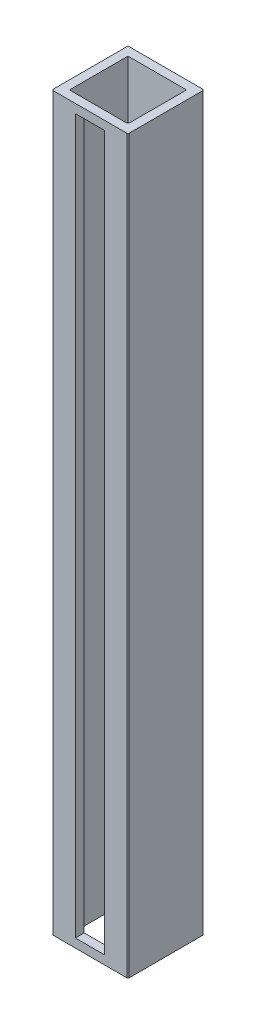
ISO-10303-21;
HEADER;
FILE_DESCRIPTION(('STEP AP214'),'2;1');
FILE_NAME('part.step','',(''),(''),'','','');
FILE_SCHEMA(('AUTOMOTIVE_DESIGN { 1 0 10303 214 1 1 1 1 }'));
ENDSEC;
DATA;
#1=APPLICATION_CONTEXT('core data for automotive mechanical design processes');
#2=APPLICATION_PROTOCOL_DEFINITION('international standard','automotive_design',2000,#1);
#3=PRODUCT_CONTEXT('',#1,'mechanical');
#4=PRODUCT('Part','Part','',(#3));
#5=PRODUCT_RELATED_PRODUCT_CATEGORY('part','',(#4));
#6=PRODUCT_DEFINITION_FORMATION('','',#4);
#7=PRODUCT_DEFINITION_CONTEXT('part definition',#1,'design');
#8=PRODUCT_DEFINITION('design','',#6,#7);
#9=PRODUCT_DEFINITION_SHAPE('','',#8);
#10=(LENGTH_UNIT() NAMED_UNIT(*) SI_UNIT(.MILLI.,.METRE.));
#11=(NAMED_UNIT(*) PLANE_ANGLE_UNIT() SI_UNIT($,.RADIAN.));
#12=(NAMED_UNIT(*) SI_UNIT($,.STERADIAN.) SOLID_ANGLE_UNIT());
#13=UNCERTAINTY_MEASURE_WITH_UNIT(LENGTH_MEASURE(1.E-05),#10,'distance_accuracy_value','');
#14=(GEOMETRIC_REPRESENTATION_CONTEXT(3) GLOBAL_UNCERTAINTY_ASSIGNED_CONTEXT((#13)) GLOBAL_UNIT_ASSIGNED_CONTEXT((#10,
#11,#12)) REPRESENTATION_CONTEXT('',''));
#15=CARTESIAN_POINT('',(0.,0.,0.));
#16=DIRECTION('',(0.,0.,1.));
#17=DIRECTION('',(1.,0.,0.));
#18=AXIS2_PLACEMENT_3D('',#15,#16,#17);
#19=CARTESIAN_POINT('',(0.,250.,0.));
#20=DIRECTION('',(0.,-1.,0.));
#21=DIRECTION('',(0.,0.,-1.));
#22=AXIS2_PLACEMENT_3D('',#19,#20,#21);
#23=PLANE('',#22);
#24=DIRECTION('',(0.,0.,-1.));
#25=VECTOR('',#24,1.);
#26=CARTESIAN_POINT('',(13.,250.,13.));
#27=LINE('',#26,#25);
#28=CARTESIAN_POINT('',(13.,250.,12.7));
#29=VERTEX_POINT('',#28);
#30=CARTESIAN_POINT('',(13.,250.,-12.7));
#31=VERTEX_POINT('',#30);
#32=EDGE_CURVE('E227',#29,#31,#27,.T.);
#33=ORIENTED_EDGE('',*,*,#32,.T.);
#34=DIRECTION('',(0.707106781186548,0.,0.707106781186548));
#35=VECTOR('',#34,1.);
#36=CARTESIAN_POINT('',(12.7,250.,-13.));
#37=LINE('',#36,#35);
#38=CARTESIAN_POINT('',(12.7,250.,-13.));
#39=VERTEX_POINT('',#38);
#40=EDGE_CURVE('E269',#31,#39,#37,.F.);
#41=ORIENTED_EDGE('',*,*,#40,.T.);
#42=DIRECTION('',(-1.,0.,0.));
#43=VECTOR('',#42,1.);
#44=CARTESIAN_POINT('',(-13.,250.,-13.));
#45=LINE('',#44,#43);
#46=CARTESIAN_POINT('',(-13.,250.,-13.));
#47=VERTEX_POINT('',#46);
#48=EDGE_CURVE('E230',#39,#47,#45,.T.);
#49=ORIENTED_EDGE('',*,*,#48,.T.);
#50=DIRECTION('',(0.,0.,1.));
#51=VECTOR('',#50,1.);
#52=CARTESIAN_POINT('',(-13.,250.,13.));
#53=LINE('',#52,#51);
#54=CARTESIAN_POINT('',(-13.,250.,12.7));
#55=VERTEX_POINT('',#54);
#56=EDGE_CURVE('E233',#47,#55,#53,.T.);
#57=ORIENTED_EDGE('',*,*,#56,.T.);
#58=DIRECTION('',(-0.707106781186548,0.,-0.707106781186548));
#59=VECTOR('',#58,1.);
#60=CARTESIAN_POINT('',(-12.7,250.,13.));
#61=LINE('',#60,#59);
#62=CARTESIAN_POINT('',(-12.7,250.,13.));
#63=VERTEX_POINT('',#62);
#64=EDGE_CURVE('E267',#55,#63,#61,.F.);
#65=ORIENTED_EDGE('',*,*,#64,.T.);
#66=DIRECTION('',(1.,0.,0.));
#67=VECTOR('',#66,1.);
#68=CARTESIAN_POINT('',(-13.,250.,13.));
#69=LINE('',#68,#67);
#70=CARTESIAN_POINT('',(12.7,250.,13.));
#71=VERTEX_POINT('',#70);
#72=EDGE_CURVE('E236',#63,#71,#69,.T.);
#73=ORIENTED_EDGE('',*,*,#72,.T.);
#74=DIRECTION('',(-0.707106781186548,0.,0.707106781186548));
#75=VECTOR('',#74,1.);
#76=CARTESIAN_POINT('',(13.,250.,12.7));
#77=LINE('',#76,#75);
#78=EDGE_CURVE('E265',#71,#29,#77,.F.);
#79=ORIENTED_EDGE('',*,*,#78,.T.);
#80=EDGE_LOOP('',(#33,#41,#49,#57,#65,#73,#79));
#81=FACE_BOUND('',#80,.T.);
#82=DIRECTION('',(0.,0.,-1.));
#83=VECTOR('',#82,1.);
#84=CARTESIAN_POINT('',(10.,250.,0.));
#85=LINE('',#84,#83);
#86=CARTESIAN_POINT('',(10.,250.,9.69999999999998));
#87=VERTEX_POINT('',#86);
#88=CARTESIAN_POINT('',(10.,250.,-10.));
#89=VERTEX_POINT('',#88);
#90=EDGE_CURVE('E214',#87,#89,#85,.T.);
#91=ORIENTED_EDGE('',*,*,#90,.F.);
#92=DIRECTION('',(0.707106781186546,0.,-0.70710678118655));
#93=VECTOR('',#92,1.);
#94=CARTESIAN_POINT('',(9.85000000000002,250.,9.84999999999996));
#95=LINE('',#94,#93);
#96=CARTESIAN_POINT('',(9.69999999999998,250.,10.));
#97=VERTEX_POINT('',#96);
#98=EDGE_CURVE('E11',#87,#97,#95,.F.);
#99=ORIENTED_EDGE('',*,*,#98,.T.);
#100=DIRECTION('',(1.,0.,0.));
#101=VECTOR('',#100,1.);
#102=CARTESIAN_POINT('',(0.,250.,10.));
#103=LINE('',#102,#101);
#104=CARTESIAN_POINT('',(-10.,250.,10.));
#105=VERTEX_POINT('',#104);
#106=EDGE_CURVE('E208',#105,#97,#103,.T.);
#107=ORIENTED_EDGE('',*,*,#106,.F.);
#108=DIRECTION('',(0.,0.,1.));
#109=VECTOR('',#108,1.);
#110=CARTESIAN_POINT('',(-10.,250.,0.));
#111=LINE('',#110,#109);
#112=CARTESIAN_POINT('',(-10.,250.,-10.));
#113=VERTEX_POINT('',#112);
#114=EDGE_CURVE('E223',#113,#105,#111,.T.);
#115=ORIENTED_EDGE('',*,*,#114,.F.);
#116=DIRECTION('',(-1.,0.,0.));
#117=VECTOR('',#116,1.);
#118=CARTESIAN_POINT('',(0.,250.,-10.));
#119=LINE('',#118,#117);
#120=EDGE_CURVE('E221',#89,#113,#119,.T.);
#121=ORIENTED_EDGE('',*,*,#120,.F.);
#122=EDGE_LOOP('',(#91,#99,#107,#115,#121));
#123=FACE_BOUND('',#122,.T.);
#124=ADVANCED_FACE('F41',(#81,#123),#23,.F.);
#125=CARTESIAN_POINT('',(0.,0.,0.));
#126=DIRECTION('',(0.,-1.,0.));
#127=DIRECTION('',(0.,0.,-1.));
#128=AXIS2_PLACEMENT_3D('',#125,#126,#127);
#129=PLANE('',#128);
#130=DIRECTION('',(-1.,0.,0.));
#131=VECTOR('',#130,1.);
#132=CARTESIAN_POINT('',(-13.,0.,-13.));
#133=LINE('',#132,#131);
#134=CARTESIAN_POINT('',(12.7,0.,-13.));
#135=VERTEX_POINT('',#134);
#136=CARTESIAN_POINT('',(-13.,0.,-13.));
#137=VERTEX_POINT('',#136);
#138=EDGE_CURVE('E242',#135,#137,#133,.T.);
#139=ORIENTED_EDGE('',*,*,#138,.F.);
#140=DIRECTION('',(-0.707106781186548,0.,-0.707106781186548));
#141=VECTOR('',#140,1.);
#142=CARTESIAN_POINT('',(12.85,0.,-12.85));
#143=LINE('',#142,#141);
#144=CARTESIAN_POINT('',(13.,0.,-12.7));
#145=VERTEX_POINT('',#144);
#146=EDGE_CURVE('E258',#135,#145,#143,.F.);
#147=ORIENTED_EDGE('',*,*,#146,.T.);
#148=DIRECTION('',(0.,0.,-1.));
#149=VECTOR('',#148,1.);
#150=CARTESIAN_POINT('',(13.,0.,13.));
#151=LINE('',#150,#149);
#152=CARTESIAN_POINT('',(13.,0.,12.7));
#153=VERTEX_POINT('',#152);
#154=EDGE_CURVE('E202',#153,#145,#151,.T.);
#155=ORIENTED_EDGE('',*,*,#154,.F.);
#156=DIRECTION('',(0.707106781186548,0.,-0.707106781186548));
#157=VECTOR('',#156,1.);
#158=CARTESIAN_POINT('',(12.85,0.,12.85));
#159=LINE('',#158,#157);
#160=CARTESIAN_POINT('',(12.7,0.,13.));
#161=VERTEX_POINT('',#160);
#162=EDGE_CURVE('E254',#153,#161,#159,.F.);
#163=ORIENTED_EDGE('',*,*,#162,.T.);
#164=DIRECTION('',(1.,0.,0.));
#165=VECTOR('',#164,1.);
#166=CARTESIAN_POINT('',(-13.,0.,13.));
#167=LINE('',#166,#165);
#168=CARTESIAN_POINT('',(-12.7,0.,13.));
#169=VERTEX_POINT('',#168);
#170=EDGE_CURVE('E231',#169,#161,#167,.T.);
#171=ORIENTED_EDGE('',*,*,#170,.F.);
#172=DIRECTION('',(0.707106781186548,0.,0.707106781186548));
#173=VECTOR('',#172,1.);
#174=CARTESIAN_POINT('',(-12.85,0.,12.85));
#175=LINE('',#174,#173);
#176=CARTESIAN_POINT('',(-13.,0.,12.7));
#177=VERTEX_POINT('',#176);
#178=EDGE_CURVE('E256',#169,#177,#175,.F.);
#179=ORIENTED_EDGE('',*,*,#178,.T.);
#180=DIRECTION('',(0.,0.,1.));
#181=VECTOR('',#180,1.);
#182=CARTESIAN_POINT('',(-13.,0.,13.));
#183=LINE('',#182,#181);
#184=EDGE_CURVE('E244',#137,#177,#183,.T.);
#185=ORIENTED_EDGE('',*,*,#184,.F.);
#186=EDGE_LOOP('',(#139,#147,#155,#163,#171,#179,#185));
#187=FACE_BOUND('',#186,.T.);
#188=DIRECTION('',(1.,0.,0.));
#189=VECTOR('',#188,1.);
#190=CARTESIAN_POINT('',(0.,0.,10.));
#191=LINE('',#190,#189);
#192=CARTESIAN_POINT('',(-10.,0.,10.));
#193=VERTEX_POINT('',#192);
#194=CARTESIAN_POINT('',(9.69999999999998,0.,10.));
#195=VERTEX_POINT('',#194);
#196=EDGE_CURVE('E211',#193,#195,#191,.T.);
#197=ORIENTED_EDGE('',*,*,#196,.T.);
#198=DIRECTION('',(-0.707106781186546,0.,0.70710678118655));
#199=VECTOR('',#198,1.);
#200=CARTESIAN_POINT('',(9.69999999999998,0.,10.));
#201=LINE('',#200,#199);
#202=CARTESIAN_POINT('',(10.,0.,9.69999999999998));
#203=VERTEX_POINT('',#202);
#204=EDGE_CURVE('E50',#195,#203,#201,.F.);
#205=ORIENTED_EDGE('',*,*,#204,.T.);
#206=DIRECTION('',(0.,0.,-1.));
#207=VECTOR('',#206,1.);
#208=CARTESIAN_POINT('',(10.,0.,0.));
#209=LINE('',#208,#207);
#210=CARTESIAN_POINT('',(10.,0.,-10.));
#211=VERTEX_POINT('',#210);
#212=EDGE_CURVE('E195',#203,#211,#209,.T.);
#213=ORIENTED_EDGE('',*,*,#212,.T.);
#214=DIRECTION('',(-1.,0.,0.));
#215=VECTOR('',#214,1.);
#216=CARTESIAN_POINT('',(0.,0.,-10.));
#217=LINE('',#216,#215);
#218=CARTESIAN_POINT('',(-10.,0.,-10.));
#219=VERTEX_POINT('',#218);
#220=EDGE_CURVE('E210',#211,#219,#217,.T.);
#221=ORIENTED_EDGE('',*,*,#220,.T.);
#222=DIRECTION('',(0.,0.,1.));
#223=VECTOR('',#222,1.);
#224=CARTESIAN_POINT('',(-10.,0.,0.));
#225=LINE('',#224,#223);
#226=EDGE_CURVE('E215',#219,#193,#225,.T.);
#227=ORIENTED_EDGE('',*,*,#226,.T.);
#228=EDGE_LOOP('',(#197,#205,#213,#221,#227));
#229=FACE_BOUND('',#228,.T.);
#230=ADVANCED_FACE('F282',(#187,#229),#129,.T.);
#231=CARTESIAN_POINT('',(13.,250.,13.));
#232=DIRECTION('',(-1.,0.,0.));
#233=DIRECTION('',(0.,0.,1.));
#234=AXIS2_PLACEMENT_3D('',#231,#232,#233);
#235=PLANE('',#234);
#236=ORIENTED_EDGE('',*,*,#154,.T.);
#237=DIRECTION('',(0.,1.,0.));
#238=VECTOR('',#237,1.);
#239=CARTESIAN_POINT('',(13.,250.,-12.7));
#240=LINE('',#239,#238);
#241=EDGE_CURVE('E263',#145,#31,#240,.T.);
#242=ORIENTED_EDGE('',*,*,#241,.T.);
#243=ORIENTED_EDGE('',*,*,#32,.F.);
#244=DIRECTION('',(0.,-1.,0.));
#245=VECTOR('',#244,1.);
#246=CARTESIAN_POINT('',(13.,250.,12.7));
#247=LINE('',#246,#245);
#248=EDGE_CURVE('E260',#29,#153,#247,.T.);
#249=ORIENTED_EDGE('',*,*,#248,.T.);
#250=EDGE_LOOP('',(#236,#242,#243,#249));
#251=FACE_BOUND('',#250,.T.);
#252=ADVANCED_FACE('F313',(#251),#235,.F.);
#253=CARTESIAN_POINT('',(-13.,250.,-13.));
#254=DIRECTION('',(0.,0.,1.));
#255=DIRECTION('',(1.,0.,0.));
#256=AXIS2_PLACEMENT_3D('',#253,#254,#255);
#257=PLANE('',#256);
#258=ORIENTED_EDGE('',*,*,#48,.F.);
#259=DIRECTION('',(0.,-1.,0.));
#260=VECTOR('',#259,1.);
#261=CARTESIAN_POINT('',(12.7,250.,-13.));
#262=LINE('',#261,#260);
#263=EDGE_CURVE('E251',#39,#135,#262,.T.);
#264=ORIENTED_EDGE('',*,*,#263,.T.);
#265=ORIENTED_EDGE('',*,*,#138,.T.);
#266=DIRECTION('',(0.,-1.,0.));
#267=VECTOR('',#266,1.);
#268=CARTESIAN_POINT('',(-13.,250.,-13.));
#269=LINE('',#268,#267);
#270=EDGE_CURVE('E239',#47,#137,#269,.T.);
#271=ORIENTED_EDGE('',*,*,#270,.F.);
#272=EDGE_LOOP('',(#258,#264,#265,#271));
#273=FACE_BOUND('',#272,.T.);
#274=ADVANCED_FACE('F324',(#273),#257,.F.);
#275=CARTESIAN_POINT('',(-13.,250.,13.));
#276=DIRECTION('',(1.,0.,0.));
#277=DIRECTION('',(0.,0.,-1.));
#278=AXIS2_PLACEMENT_3D('',#275,#276,#277);
#279=PLANE('',#278);
#280=ORIENTED_EDGE('',*,*,#184,.T.);
#281=DIRECTION('',(0.,1.,0.));
#282=VECTOR('',#281,1.);
#283=CARTESIAN_POINT('',(-13.,250.,12.7));
#284=LINE('',#283,#282);
#285=EDGE_CURVE('E280',#177,#55,#284,.T.);
#286=ORIENTED_EDGE('',*,*,#285,.T.);
#287=ORIENTED_EDGE('',*,*,#56,.F.);
#288=ORIENTED_EDGE('',*,*,#270,.T.);
#289=EDGE_LOOP('',(#280,#286,#287,#288));
#290=FACE_BOUND('',#289,.T.);
#291=ADVANCED_FACE('F320',(#290),#279,.F.);
#292=CARTESIAN_POINT('',(-13.,250.,13.));
#293=DIRECTION('',(0.,0.,-1.));
#294=DIRECTION('',(-1.,0.,0.));
#295=AXIS2_PLACEMENT_3D('',#292,#293,#294);
#296=PLANE('',#295);
#297=DIRECTION('',(1.,0.,0.));
#298=VECTOR('',#297,1.);
#299=CARTESIAN_POINT('',(5.,3.,13.));
#300=LINE('',#299,#298);
#301=CARTESIAN_POINT('',(-5.,3.,13.));
#302=VERTEX_POINT('',#301);
#303=CARTESIAN_POINT('',(5.,3.,13.));
#304=VERTEX_POINT('',#303);
#305=EDGE_CURVE('E189',#302,#304,#300,.T.);
#306=ORIENTED_EDGE('',*,*,#305,.F.);
#307=DIRECTION('',(0.,-1.,0.));
#308=VECTOR('',#307,1.);
#309=CARTESIAN_POINT('',(-5.,3.,13.));
#310=LINE('',#309,#308);
#311=CARTESIAN_POINT('',(-5.,247.,13.));
#312=VERTEX_POINT('',#311);
#313=EDGE_CURVE('E162',#312,#302,#310,.T.);
#314=ORIENTED_EDGE('',*,*,#313,.F.);
#315=DIRECTION('',(-1.,0.,0.));
#316=VECTOR('',#315,1.);
#317=CARTESIAN_POINT('',(5.,247.,13.));
#318=LINE('',#317,#316);
#319=CARTESIAN_POINT('',(5.,247.,13.));
#320=VERTEX_POINT('',#319);
#321=EDGE_CURVE('E180',#320,#312,#318,.T.);
#322=ORIENTED_EDGE('',*,*,#321,.F.);
#323=DIRECTION('',(0.,1.,0.));
#324=VECTOR('',#323,1.);
#325=CARTESIAN_POINT('',(5.,3.,13.));
#326=LINE('',#325,#324);
#327=EDGE_CURVE('E183',#304,#320,#326,.T.);
#328=ORIENTED_EDGE('',*,*,#327,.F.);
#329=EDGE_LOOP('',(#306,#314,#322,#328));
#330=FACE_BOUND('',#329,.T.);
#331=ORIENTED_EDGE('',*,*,#72,.F.);
#332=DIRECTION('',(0.,-1.,0.));
#333=VECTOR('',#332,1.);
#334=CARTESIAN_POINT('',(-12.7,250.,13.));
#335=LINE('',#334,#333);
#336=EDGE_CURVE('E277',#63,#169,#335,.T.);
#337=ORIENTED_EDGE('',*,*,#336,.T.);
#338=ORIENTED_EDGE('',*,*,#170,.T.);
#339=DIRECTION('',(0.,1.,0.));
#340=VECTOR('',#339,1.);
#341=CARTESIAN_POINT('',(12.7,250.,13.));
#342=LINE('',#341,#340);
#343=EDGE_CURVE('E275',#161,#71,#342,.T.);
#344=ORIENTED_EDGE('',*,*,#343,.T.);
#345=EDGE_LOOP('',(#331,#337,#338,#344));
#346=FACE_BOUND('',#345,.T.);
#347=ADVANCED_FACE('F304',(#330,#346),#296,.F.);
#348=CARTESIAN_POINT('',(10.,250.,13.));
#349=DIRECTION('',(-1.,0.,0.));
#350=DIRECTION('',(0.,0.,1.));
#351=AXIS2_PLACEMENT_3D('',#348,#349,#350);
#352=PLANE('',#351);
#353=ORIENTED_EDGE('',*,*,#212,.F.);
#354=DIRECTION('',(0.,1.,0.));
#355=VECTOR('',#354,1.);
#356=CARTESIAN_POINT('',(10.,250.,9.69999999999998));
#357=LINE('',#356,#355);
#358=EDGE_CURVE('E63',#203,#87,#357,.T.);
#359=ORIENTED_EDGE('',*,*,#358,.T.);
#360=ORIENTED_EDGE('',*,*,#90,.T.);
#361=DIRECTION('',(0.,-1.,0.));
#362=VECTOR('',#361,1.);
#363=CARTESIAN_POINT('',(10.,250.,-10.));
#364=LINE('',#363,#362);
#365=EDGE_CURVE('E199',#89,#211,#364,.T.);
#366=ORIENTED_EDGE('',*,*,#365,.T.);
#367=EDGE_LOOP('',(#353,#359,#360,#366));
#368=FACE_BOUND('',#367,.T.);
#369=ADVANCED_FACE('F287',(#368),#352,.T.);
#370=CARTESIAN_POINT('',(-13.,250.,-10.));
#371=DIRECTION('',(0.,0.,1.));
#372=DIRECTION('',(1.,0.,0.));
#373=AXIS2_PLACEMENT_3D('',#370,#371,#372);
#374=PLANE('',#373);
#375=ORIENTED_EDGE('',*,*,#220,.F.);
#376=ORIENTED_EDGE('',*,*,#365,.F.);
#377=ORIENTED_EDGE('',*,*,#120,.T.);
#378=DIRECTION('',(0.,-1.,0.));
#379=VECTOR('',#378,1.);
#380=CARTESIAN_POINT('',(-10.,250.,-10.));
#381=LINE('',#380,#379);
#382=EDGE_CURVE('E203',#113,#219,#381,.T.);
#383=ORIENTED_EDGE('',*,*,#382,.T.);
#384=EDGE_LOOP('',(#375,#376,#377,#383));
#385=FACE_BOUND('',#384,.T.);
#386=ADVANCED_FACE('F296',(#385),#374,.T.);
#387=CARTESIAN_POINT('',(-10.,250.,13.));
#388=DIRECTION('',(1.,0.,0.));
#389=DIRECTION('',(0.,0.,-1.));
#390=AXIS2_PLACEMENT_3D('',#387,#388,#389);
#391=PLANE('',#390);
#392=ORIENTED_EDGE('',*,*,#226,.F.);
#393=ORIENTED_EDGE('',*,*,#382,.F.);
#394=ORIENTED_EDGE('',*,*,#114,.T.);
#395=DIRECTION('',(0.,-1.,0.));
#396=VECTOR('',#395,1.);
#397=CARTESIAN_POINT('',(-10.,250.,10.));
#398=LINE('',#397,#396);
#399=EDGE_CURVE('E206',#105,#193,#398,.T.);
#400=ORIENTED_EDGE('',*,*,#399,.T.);
#401=EDGE_LOOP('',(#392,#393,#394,#400));
#402=FACE_BOUND('',#401,.T.);
#403=ADVANCED_FACE('F294',(#402),#391,.T.);
#404=CARTESIAN_POINT('',(-13.,250.,10.));
#405=DIRECTION('',(0.,0.,-1.));
#406=DIRECTION('',(-1.,0.,0.));
#407=AXIS2_PLACEMENT_3D('',#404,#405,#406);
#408=PLANE('',#407);
#409=DIRECTION('',(0.,-1.,0.));
#410=VECTOR('',#409,1.);
#411=CARTESIAN_POINT('',(-5.,3.,10.));
#412=LINE('',#411,#410);
#413=CARTESIAN_POINT('',(-5.,247.,10.));
#414=VERTEX_POINT('',#413);
#415=CARTESIAN_POINT('',(-5.,3.,10.));
#416=VERTEX_POINT('',#415);
#417=EDGE_CURVE('E159',#414,#416,#412,.T.);
#418=ORIENTED_EDGE('',*,*,#417,.T.);
#419=DIRECTION('',(1.,0.,0.));
#420=VECTOR('',#419,1.);
#421=CARTESIAN_POINT('',(5.,3.,10.));
#422=LINE('',#421,#420);
#423=CARTESIAN_POINT('',(5.,3.,10.));
#424=VERTEX_POINT('',#423);
#425=EDGE_CURVE('E171',#416,#424,#422,.T.);
#426=ORIENTED_EDGE('',*,*,#425,.T.);
#427=DIRECTION('',(0.,1.,0.));
#428=VECTOR('',#427,1.);
#429=CARTESIAN_POINT('',(5.,3.,10.));
#430=LINE('',#429,#428);
#431=CARTESIAN_POINT('',(5.,247.,10.));
#432=VERTEX_POINT('',#431);
#433=EDGE_CURVE('E175',#424,#432,#430,.T.);
#434=ORIENTED_EDGE('',*,*,#433,.T.);
#435=DIRECTION('',(-1.,0.,0.));
#436=VECTOR('',#435,1.);
#437=CARTESIAN_POINT('',(5.,247.,10.));
#438=LINE('',#437,#436);
#439=EDGE_CURVE('E167',#432,#414,#438,.T.);
#440=ORIENTED_EDGE('',*,*,#439,.T.);
#441=EDGE_LOOP('',(#418,#426,#434,#440));
#442=FACE_BOUND('',#441,.T.);
#443=ORIENTED_EDGE('',*,*,#106,.T.);
#444=DIRECTION('',(0.,-1.,0.));
#445=VECTOR('',#444,1.);
#446=CARTESIAN_POINT('',(9.69999999999998,0.,10.));
#447=LINE('',#446,#445);
#448=EDGE_CURVE('E271',#97,#195,#447,.T.);
#449=ORIENTED_EDGE('',*,*,#448,.T.);
#450=ORIENTED_EDGE('',*,*,#196,.F.);
#451=ORIENTED_EDGE('',*,*,#399,.F.);
#452=EDGE_LOOP('',(#443,#449,#450,#451));
#453=FACE_BOUND('',#452,.T.);
#454=ADVANCED_FACE('F177',(#442,#453),#408,.T.);
#455=CARTESIAN_POINT('',(-5.,3.,10.));
#456=DIRECTION('',(-1.,0.,0.));
#457=DIRECTION('',(0.,0.,1.));
#458=AXIS2_PLACEMENT_3D('',#455,#456,#457);
#459=PLANE('',#458);
#460=ORIENTED_EDGE('',*,*,#313,.T.);
#461=DIRECTION('',(0.,0.,1.));
#462=VECTOR('',#461,1.);
#463=CARTESIAN_POINT('',(-5.,3.,10.));
#464=LINE('',#463,#462);
#465=EDGE_CURVE('E155',#416,#302,#464,.T.);
#466=ORIENTED_EDGE('',*,*,#465,.F.);
#467=ORIENTED_EDGE('',*,*,#417,.F.);
#468=DIRECTION('',(0.,0.,1.));
#469=VECTOR('',#468,1.);
#470=CARTESIAN_POINT('',(-5.,247.,10.));
#471=LINE('',#470,#469);
#472=EDGE_CURVE('E193',#414,#312,#471,.T.);
#473=ORIENTED_EDGE('',*,*,#472,.T.);
#474=EDGE_LOOP('',(#460,#466,#467,#473));
#475=FACE_BOUND('',#474,.T.);
#476=ADVANCED_FACE('F157',(#475),#459,.F.);
#477=CARTESIAN_POINT('',(5.,247.,10.));
#478=DIRECTION('',(0.,1.,0.));
#479=DIRECTION('',(0.,0.,1.));
#480=AXIS2_PLACEMENT_3D('',#477,#478,#479);
#481=PLANE('',#480);
#482=ORIENTED_EDGE('',*,*,#321,.T.);
#483=ORIENTED_EDGE('',*,*,#472,.F.);
#484=ORIENTED_EDGE('',*,*,#439,.F.);
#485=DIRECTION('',(0.,0.,1.));
#486=VECTOR('',#485,1.);
#487=CARTESIAN_POINT('',(5.,247.,10.));
#488=LINE('',#487,#486);
#489=EDGE_CURVE('E196',#432,#320,#488,.T.);
#490=ORIENTED_EDGE('',*,*,#489,.T.);
#491=EDGE_LOOP('',(#482,#483,#484,#490));
#492=FACE_BOUND('',#491,.T.);
#493=ADVANCED_FACE('F409',(#492),#481,.F.);
#494=CARTESIAN_POINT('',(5.,3.,10.));
#495=DIRECTION('',(1.,0.,0.));
#496=DIRECTION('',(0.,0.,-1.));
#497=AXIS2_PLACEMENT_3D('',#494,#495,#496);
#498=PLANE('',#497);
#499=ORIENTED_EDGE('',*,*,#327,.T.);
#500=ORIENTED_EDGE('',*,*,#489,.F.);
#501=ORIENTED_EDGE('',*,*,#433,.F.);
#502=DIRECTION('',(0.,0.,1.));
#503=VECTOR('',#502,1.);
#504=CARTESIAN_POINT('',(5.,3.,10.));
#505=LINE('',#504,#503);
#506=EDGE_CURVE('E166',#424,#304,#505,.T.);
#507=ORIENTED_EDGE('',*,*,#506,.T.);
#508=EDGE_LOOP('',(#499,#500,#501,#507));
#509=FACE_BOUND('',#508,.T.);
#510=ADVANCED_FACE('F400',(#509),#498,.F.);
#511=CARTESIAN_POINT('',(5.,3.,10.));
#512=DIRECTION('',(0.,-1.,0.));
#513=DIRECTION('',(0.,0.,-1.));
#514=AXIS2_PLACEMENT_3D('',#511,#512,#513);
#515=PLANE('',#514);
#516=ORIENTED_EDGE('',*,*,#305,.T.);
#517=ORIENTED_EDGE('',*,*,#506,.F.);
#518=ORIENTED_EDGE('',*,*,#425,.F.);
#519=ORIENTED_EDGE('',*,*,#465,.T.);
#520=EDGE_LOOP('',(#516,#517,#518,#519));
#521=FACE_BOUND('',#520,.T.);
#522=ADVANCED_FACE('F172',(#521),#515,.F.);
#523=CARTESIAN_POINT('',(12.7,250.,-13.));
#524=DIRECTION('',(-0.707106781186547,0.,0.707106781186547));
#525=DIRECTION('',(0.,-1.,0.));
#526=AXIS2_PLACEMENT_3D('',#523,#524,#525);
#527=PLANE('',#526);
#528=ORIENTED_EDGE('',*,*,#40,.F.);
#529=ORIENTED_EDGE('',*,*,#241,.F.);
#530=ORIENTED_EDGE('',*,*,#146,.F.);
#531=ORIENTED_EDGE('',*,*,#263,.F.);
#532=EDGE_LOOP('',(#528,#529,#530,#531));
#533=FACE_BOUND('',#532,.T.);
#534=ADVANCED_FACE('F333',(#533),#527,.F.);
#535=CARTESIAN_POINT('',(9.69999999999998,250.,10.));
#536=DIRECTION('',(-0.70710678118655,0.,-0.707106781186546));
#537=DIRECTION('',(0.,1.,0.));
#538=AXIS2_PLACEMENT_3D('',#535,#536,#537);
#539=PLANE('',#538);
#540=ORIENTED_EDGE('',*,*,#98,.F.);
#541=ORIENTED_EDGE('',*,*,#358,.F.);
#542=ORIENTED_EDGE('',*,*,#204,.F.);
#543=ORIENTED_EDGE('',*,*,#448,.F.);
#544=EDGE_LOOP('',(#540,#541,#542,#543));
#545=FACE_BOUND('',#544,.T.);
#546=ADVANCED_FACE('F289',(#545),#539,.T.);
#547=CARTESIAN_POINT('',(-12.7,250.,13.));
#548=DIRECTION('',(0.707106781186547,0.,-0.707106781186547));
#549=DIRECTION('',(0.,-1.,0.));
#550=AXIS2_PLACEMENT_3D('',#547,#548,#549);
#551=PLANE('',#550);
#552=ORIENTED_EDGE('',*,*,#64,.F.);
#553=ORIENTED_EDGE('',*,*,#285,.F.);
#554=ORIENTED_EDGE('',*,*,#178,.F.);
#555=ORIENTED_EDGE('',*,*,#336,.F.);
#556=EDGE_LOOP('',(#552,#553,#554,#555));
#557=FACE_BOUND('',#556,.T.);
#558=ADVANCED_FACE('F344',(#557),#551,.F.);
#559=CARTESIAN_POINT('',(13.,250.,12.7));
#560=DIRECTION('',(-0.707106781186547,0.,-0.707106781186547));
#561=DIRECTION('',(0.,-1.,0.));
#562=AXIS2_PLACEMENT_3D('',#559,#560,#561);
#563=PLANE('',#562);
#564=ORIENTED_EDGE('',*,*,#78,.F.);
#565=ORIENTED_EDGE('',*,*,#343,.F.);
#566=ORIENTED_EDGE('',*,*,#162,.F.);
#567=ORIENTED_EDGE('',*,*,#248,.F.);
#568=EDGE_LOOP('',(#564,#565,#566,#567));
#569=FACE_BOUND('',#568,.T.);
#570=ADVANCED_FACE('F44',(#569),#563,.F.);
#571=CLOSED_SHELL('',(#124,#230,#252,#274,#291,#347,#369,#386,#403,#454,#476,#493,#510,#522,
#534,#546,#558,#570));
#572=MANIFOLD_SOLID_BREP('B2',#571);
#573=ADVANCED_BREP_SHAPE_REPRESENTATION('',(#18,#572),#14);
#574=SHAPE_DEFINITION_REPRESENTATION(#9,#573);
ENDSEC;
END-ISO-10303-21;
